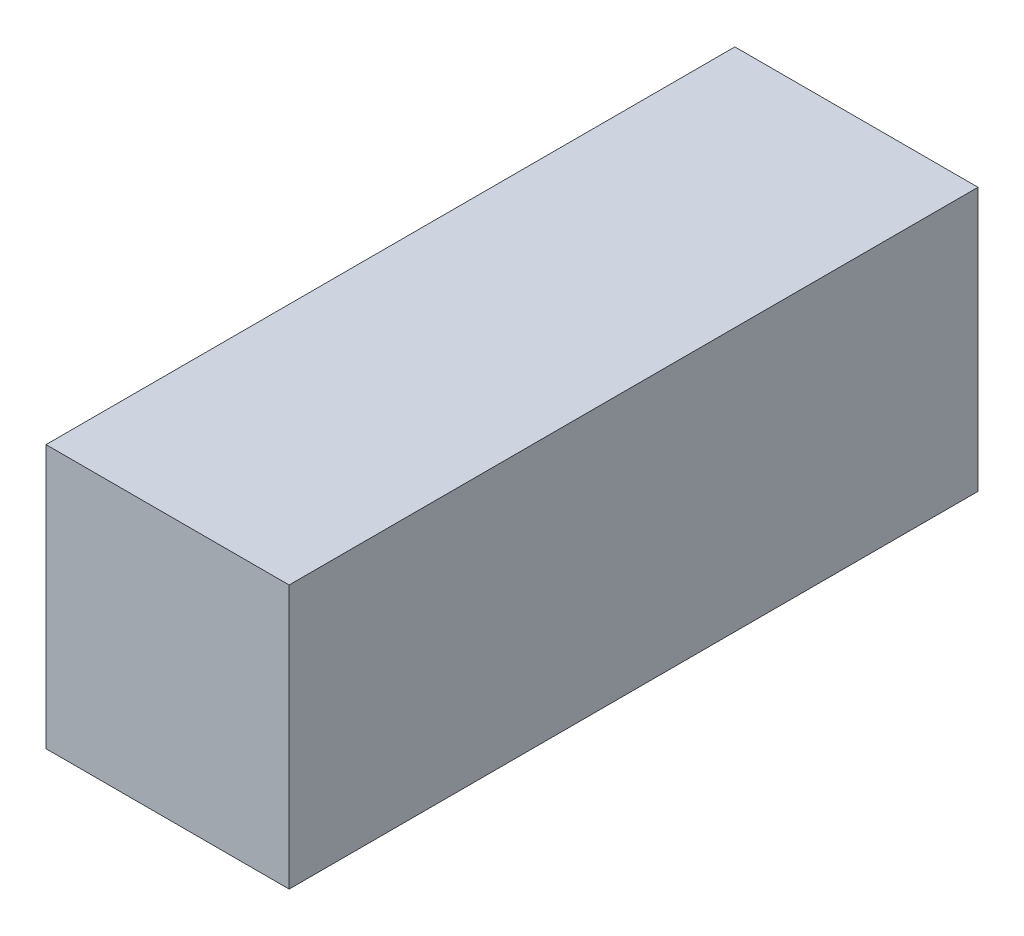
ISO-10303-21;
HEADER;
FILE_DESCRIPTION(('STEP AP214'),'2;1');
FILE_NAME('part.step','',(''),(''),'','','');
FILE_SCHEMA(('AUTOMOTIVE_DESIGN { 1 0 10303 214 1 1 1 1 }'));
ENDSEC;
DATA;
#1=APPLICATION_CONTEXT('core data for automotive mechanical design processes');
#2=APPLICATION_PROTOCOL_DEFINITION('international standard','automotive_design',2000,#1);
#3=PRODUCT_CONTEXT('',#1,'mechanical');
#4=PRODUCT('Part','Part','',(#3));
#5=PRODUCT_RELATED_PRODUCT_CATEGORY('part','',(#4));
#6=PRODUCT_DEFINITION_FORMATION('','',#4);
#7=PRODUCT_DEFINITION_CONTEXT('part definition',#1,'design');
#8=PRODUCT_DEFINITION('design','',#6,#7);
#9=PRODUCT_DEFINITION_SHAPE('','',#8);
#10=(LENGTH_UNIT() NAMED_UNIT(*) SI_UNIT(.MILLI.,.METRE.));
#11=(NAMED_UNIT(*) PLANE_ANGLE_UNIT() SI_UNIT($,.RADIAN.));
#12=(NAMED_UNIT(*) SI_UNIT($,.STERADIAN.) SOLID_ANGLE_UNIT());
#13=UNCERTAINTY_MEASURE_WITH_UNIT(LENGTH_MEASURE(1.E-05),#10,'distance_accuracy_value','');
#14=(GEOMETRIC_REPRESENTATION_CONTEXT(3) GLOBAL_UNCERTAINTY_ASSIGNED_CONTEXT((#13)) GLOBAL_UNIT_ASSIGNED_CONTEXT((#10,
#11,#12)) REPRESENTATION_CONTEXT('',''));
#15=CARTESIAN_POINT('',(0.,0.,0.));
#16=DIRECTION('',(0.,0.,1.));
#17=DIRECTION('',(1.,0.,0.));
#18=AXIS2_PLACEMENT_3D('',#15,#16,#17);
#19=CARTESIAN_POINT('',(0.57,0.,0.));
#20=DIRECTION('',(1.,0.,0.));
#21=DIRECTION('',(0.,1.,0.));
#22=AXIS2_PLACEMENT_3D('',#19,#20,#21);
#23=PLANE('',#22);
#24=DIRECTION('',(0.,1.,0.));
#25=VECTOR('',#24,1.);
#26=CARTESIAN_POINT('',(0.57,-0.65,-0.85));
#27=LINE('',#26,#25);
#28=CARTESIAN_POINT('',(0.57,-0.65,-0.85));
#29=VERTEX_POINT('',#28);
#30=CARTESIAN_POINT('',(0.57,0.,-0.85));
#31=VERTEX_POINT('',#30);
#32=EDGE_CURVE('E94',#29,#31,#27,.T.);
#33=ORIENTED_EDGE('',*,*,#32,.T.);
#34=DIRECTION('',(0.,0.,1.));
#35=VECTOR('',#34,1.);
#36=CARTESIAN_POINT('',(0.57,0.,-0.85));
#37=LINE('',#36,#35);
#38=CARTESIAN_POINT('',(0.57,0.,0.85));
#39=VERTEX_POINT('',#38);
#40=EDGE_CURVE('E11',#31,#39,#37,.T.);
#41=ORIENTED_EDGE('',*,*,#40,.T.);
#42=DIRECTION('',(0.,-1.,0.));
#43=VECTOR('',#42,1.);
#44=CARTESIAN_POINT('',(0.57,-0.65,0.85));
#45=LINE('',#44,#43);
#46=CARTESIAN_POINT('',(0.57,-0.65,0.85));
#47=VERTEX_POINT('',#46);
#48=EDGE_CURVE('E21',#39,#47,#45,.T.);
#49=ORIENTED_EDGE('',*,*,#48,.T.);
#50=DIRECTION('',(0.,0.,-1.));
#51=VECTOR('',#50,1.);
#52=CARTESIAN_POINT('',(0.57,-0.65,-0.85));
#53=LINE('',#52,#51);
#54=EDGE_CURVE('E28',#47,#29,#53,.T.);
#55=ORIENTED_EDGE('',*,*,#54,.T.);
#56=EDGE_LOOP('',(#33,#41,#49,#55));
#57=FACE_BOUND('',#56,.T.);
#58=ADVANCED_FACE('F17',(#57),#23,.T.);
#59=CARTESIAN_POINT('',(0.,0.,0.));
#60=DIRECTION('',(0.,-1.,0.));
#61=DIRECTION('',(0.,0.,-1.));
#62=AXIS2_PLACEMENT_3D('',#59,#60,#61);
#63=PLANE('',#62);
#64=DIRECTION('',(1.,0.,0.));
#65=VECTOR('',#64,1.);
#66=CARTESIAN_POINT('',(-0.03,0.,-0.85));
#67=LINE('',#66,#65);
#68=CARTESIAN_POINT('',(-0.03,0.,-0.85));
#69=VERTEX_POINT('',#68);
#70=EDGE_CURVE('E86',#69,#31,#67,.T.);
#71=ORIENTED_EDGE('',*,*,#70,.F.);
#72=DIRECTION('',(0.,0.,-1.));
#73=VECTOR('',#72,1.);
#74=CARTESIAN_POINT('',(-0.03,0.,0.85));
#75=LINE('',#74,#73);
#76=CARTESIAN_POINT('',(-0.03,0.,0.85));
#77=VERTEX_POINT('',#76);
#78=EDGE_CURVE('E68',#77,#69,#75,.T.);
#79=ORIENTED_EDGE('',*,*,#78,.F.);
#80=DIRECTION('',(-1.,0.,0.));
#81=VECTOR('',#80,1.);
#82=CARTESIAN_POINT('',(0.03,0.,0.85));
#83=LINE('',#82,#81);
#84=EDGE_CURVE('E89',#39,#77,#83,.T.);
#85=ORIENTED_EDGE('',*,*,#84,.F.);
#86=ORIENTED_EDGE('',*,*,#40,.F.);
#87=EDGE_LOOP('',(#71,#79,#85,#86));
#88=FACE_BOUND('',#87,.T.);
#89=ADVANCED_FACE('F91',(#88),#63,.F.);
#90=CARTESIAN_POINT('',(0.,-0.65,0.));
#91=DIRECTION('',(0.,-1.,0.));
#92=DIRECTION('',(0.,0.,-1.));
#93=AXIS2_PLACEMENT_3D('',#90,#91,#92);
#94=PLANE('',#93);
#95=DIRECTION('',(1.,0.,0.));
#96=VECTOR('',#95,1.);
#97=CARTESIAN_POINT('',(-0.03,-0.65,-0.85));
#98=LINE('',#97,#96);
#99=CARTESIAN_POINT('',(-0.03,-0.65,-0.85));
#100=VERTEX_POINT('',#99);
#101=EDGE_CURVE('E87',#100,#29,#98,.T.);
#102=ORIENTED_EDGE('',*,*,#101,.T.);
#103=ORIENTED_EDGE('',*,*,#54,.F.);
#104=DIRECTION('',(-1.,0.,0.));
#105=VECTOR('',#104,1.);
#106=CARTESIAN_POINT('',(0.03,-0.65,0.85));
#107=LINE('',#106,#105);
#108=CARTESIAN_POINT('',(-0.03,-0.65,0.85));
#109=VERTEX_POINT('',#108);
#110=EDGE_CURVE('E108',#47,#109,#107,.T.);
#111=ORIENTED_EDGE('',*,*,#110,.T.);
#112=DIRECTION('',(0.,0.,-1.));
#113=VECTOR('',#112,1.);
#114=CARTESIAN_POINT('',(-0.03,-0.65,0.85));
#115=LINE('',#114,#113);
#116=EDGE_CURVE('E80',#109,#100,#115,.T.);
#117=ORIENTED_EDGE('',*,*,#116,.T.);
#118=EDGE_LOOP('',(#102,#103,#111,#117));
#119=FACE_BOUND('',#118,.T.);
#120=ADVANCED_FACE('F19',(#119),#94,.T.);
#121=CARTESIAN_POINT('',(-0.03,-0.65,0.85));
#122=DIRECTION('',(1.,0.,0.));
#123=DIRECTION('',(0.,1.,0.));
#124=AXIS2_PLACEMENT_3D('',#121,#122,#123);
#125=PLANE('',#124);
#126=ORIENTED_EDGE('',*,*,#78,.T.);
#127=DIRECTION('',(0.,1.,0.));
#128=VECTOR('',#127,1.);
#129=CARTESIAN_POINT('',(-0.03,-0.65,-0.85));
#130=LINE('',#129,#128);
#131=EDGE_CURVE('E71',#100,#69,#130,.T.);
#132=ORIENTED_EDGE('',*,*,#131,.F.);
#133=ORIENTED_EDGE('',*,*,#116,.F.);
#134=DIRECTION('',(0.,1.,0.));
#135=VECTOR('',#134,1.);
#136=CARTESIAN_POINT('',(-0.03,-0.65,0.85));
#137=LINE('',#136,#135);
#138=EDGE_CURVE('E74',#109,#77,#137,.T.);
#139=ORIENTED_EDGE('',*,*,#138,.T.);
#140=EDGE_LOOP('',(#126,#132,#133,#139));
#141=FACE_BOUND('',#140,.T.);
#142=ADVANCED_FACE('F70',(#141),#125,.F.);
#143=CARTESIAN_POINT('',(0.03,-0.65,0.85));
#144=DIRECTION('',(0.,0.,-1.));
#145=DIRECTION('',(0.,-1.,0.));
#146=AXIS2_PLACEMENT_3D('',#143,#144,#145);
#147=PLANE('',#146);
#148=ORIENTED_EDGE('',*,*,#84,.T.);
#149=ORIENTED_EDGE('',*,*,#138,.F.);
#150=ORIENTED_EDGE('',*,*,#110,.F.);
#151=ORIENTED_EDGE('',*,*,#48,.F.);
#152=EDGE_LOOP('',(#148,#149,#150,#151));
#153=FACE_BOUND('',#152,.T.);
#154=ADVANCED_FACE('F118',(#153),#147,.F.);
#155=CARTESIAN_POINT('',(-0.03,-0.65,-0.85));
#156=DIRECTION('',(0.,0.,1.));
#157=DIRECTION('',(1.,0.,0.));
#158=AXIS2_PLACEMENT_3D('',#155,#156,#157);
#159=PLANE('',#158);
#160=ORIENTED_EDGE('',*,*,#70,.T.);
#161=ORIENTED_EDGE('',*,*,#32,.F.);
#162=ORIENTED_EDGE('',*,*,#101,.F.);
#163=ORIENTED_EDGE('',*,*,#131,.T.);
#164=EDGE_LOOP('',(#160,#161,#162,#163));
#165=FACE_BOUND('',#164,.T.);
#166=ADVANCED_FACE('F84',(#165),#159,.F.);
#167=CLOSED_SHELL('',(#58,#89,#120,#142,#154,#166));
#168=MANIFOLD_SOLID_BREP('B1',#167);
#169=ADVANCED_BREP_SHAPE_REPRESENTATION('',(#18,#168),#14);
#170=SHAPE_DEFINITION_REPRESENTATION(#9,#169);
ENDSEC;
END-ISO-10303-21;
